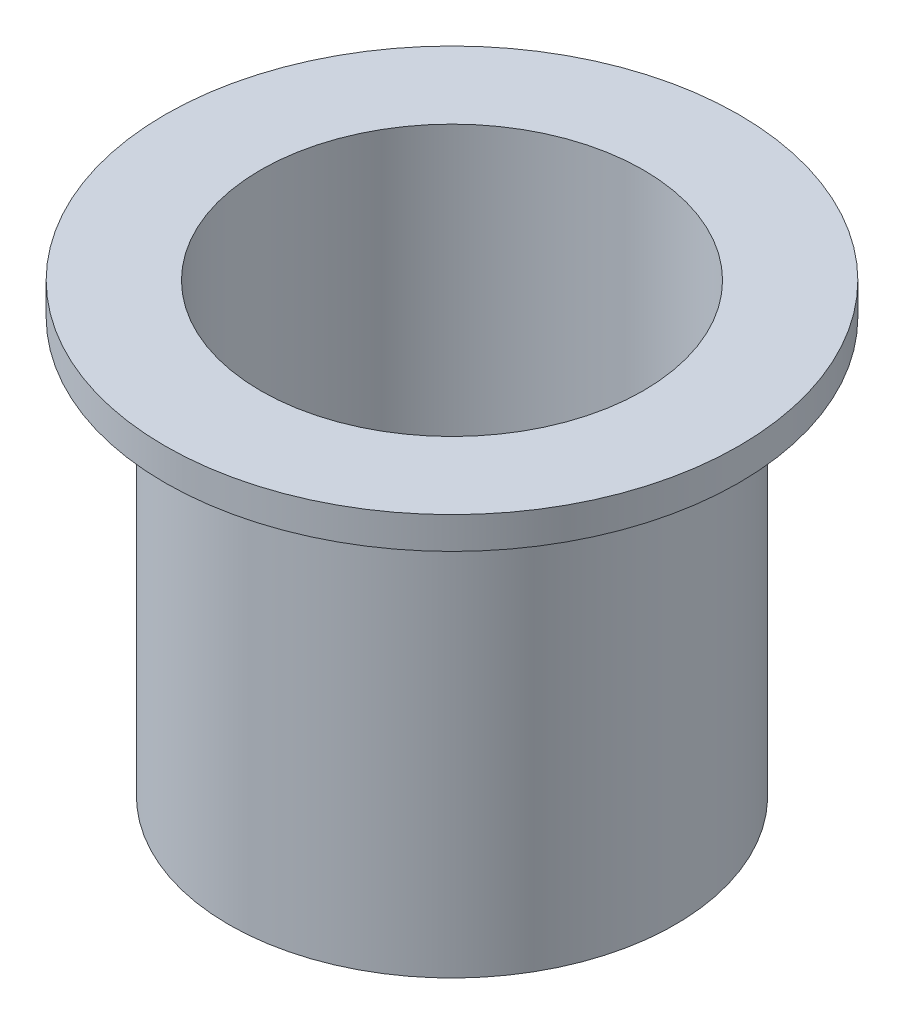
ISO-10303-21;
HEADER;
FILE_DESCRIPTION(('STEP AP214'),'2;1');
FILE_NAME('part.step','',(''),(''),'','','');
FILE_SCHEMA(('AUTOMOTIVE_DESIGN { 1 0 10303 214 1 1 1 1 }'));
ENDSEC;
DATA;
#1=APPLICATION_CONTEXT('core data for automotive mechanical design processes');
#2=APPLICATION_PROTOCOL_DEFINITION('international standard','automotive_design',2000,#1);
#3=PRODUCT_CONTEXT('',#1,'mechanical');
#4=PRODUCT('Part','Part','',(#3));
#5=PRODUCT_RELATED_PRODUCT_CATEGORY('part','',(#4));
#6=PRODUCT_DEFINITION_FORMATION('','',#4);
#7=PRODUCT_DEFINITION_CONTEXT('part definition',#1,'design');
#8=PRODUCT_DEFINITION('design','',#6,#7);
#9=PRODUCT_DEFINITION_SHAPE('','',#8);
#10=(LENGTH_UNIT() NAMED_UNIT(*) SI_UNIT(.MILLI.,.METRE.));
#11=(NAMED_UNIT(*) PLANE_ANGLE_UNIT() SI_UNIT($,.RADIAN.));
#12=(NAMED_UNIT(*) SI_UNIT($,.STERADIAN.) SOLID_ANGLE_UNIT());
#13=UNCERTAINTY_MEASURE_WITH_UNIT(LENGTH_MEASURE(1.E-05),#10,'distance_accuracy_value','');
#14=(GEOMETRIC_REPRESENTATION_CONTEXT(3) GLOBAL_UNCERTAINTY_ASSIGNED_CONTEXT((#13)) GLOBAL_UNIT_ASSIGNED_CONTEXT((#10,
#11,#12)) REPRESENTATION_CONTEXT('',''));
#15=CARTESIAN_POINT('',(0.,0.,0.));
#16=DIRECTION('',(0.,0.,1.));
#17=DIRECTION('',(1.,0.,0.));
#18=AXIS2_PLACEMENT_3D('',#15,#16,#17);
#19=CARTESIAN_POINT('',(0.,13.,0.));
#20=DIRECTION('',(0.,-1.,0.));
#21=DIRECTION('',(0.,0.,-1.));
#22=AXIS2_PLACEMENT_3D('',#19,#20,#21);
#23=CYLINDRICAL_SURFACE('',#22,7.);
#24=CARTESIAN_POINT('',(0.,13.,0.));
#25=DIRECTION('',(0.,1.,0.));
#26=DIRECTION('',(0.,0.,1.));
#27=AXIS2_PLACEMENT_3D('',#24,#25,#26);
#28=CIRCLE('',#27,7.);
#29=CARTESIAN_POINT('',(0.,13.,-7.));
#30=VERTEX_POINT('',#29);
#31=EDGE_CURVE('E10',#30,#30,#28,.T.);
#32=CARTESIAN_POINT('',(0.,0.,0.));
#33=DIRECTION('',(0.,1.,0.));
#34=DIRECTION('',(0.,0.,1.));
#35=AXIS2_PLACEMENT_3D('',#32,#33,#34);
#36=CIRCLE('',#35,7.);
#37=CARTESIAN_POINT('',(0.,0.,-7.));
#38=VERTEX_POINT('',#37);
#39=EDGE_CURVE('E40',#38,#38,#36,.T.);
#40=CARTESIAN_POINT('',(0.,13.,-7.));
#41=CARTESIAN_POINT('',(0.,12.8645833333333,-7.));
#42=CARTESIAN_POINT('',(0.,12.7291666666667,-7.));
#43=CARTESIAN_POINT('',(0.,12.4583333333333,-7.));
#44=CARTESIAN_POINT('',(0.,12.3229166666667,-7.));
#45=CARTESIAN_POINT('',(0.,12.0520833333333,-7.));
#46=CARTESIAN_POINT('',(0.,11.9166666666667,-7.));
#47=CARTESIAN_POINT('',(0.,11.6458333333333,-7.));
#48=CARTESIAN_POINT('',(0.,11.5104166666667,-7.));
#49=CARTESIAN_POINT('',(0.,11.2395833333333,-7.));
#50=CARTESIAN_POINT('',(0.,11.1041666666667,-7.));
#51=CARTESIAN_POINT('',(0.,10.8333333333333,-7.));
#52=CARTESIAN_POINT('',(0.,10.6979166666667,-7.));
#53=CARTESIAN_POINT('',(0.,10.4270833333333,-7.));
#54=CARTESIAN_POINT('',(0.,10.2916666666667,-7.));
#55=CARTESIAN_POINT('',(0.,10.0208333333333,-7.));
#56=CARTESIAN_POINT('',(0.,9.88541666666667,-7.));
#57=CARTESIAN_POINT('',(0.,9.61458333333333,-7.));
#58=CARTESIAN_POINT('',(0.,9.47916666666667,-7.));
#59=CARTESIAN_POINT('',(0.,9.20833333333333,-7.));
#60=CARTESIAN_POINT('',(0.,9.07291666666667,-7.));
#61=CARTESIAN_POINT('',(0.,8.80208333333333,-7.));
#62=CARTESIAN_POINT('',(0.,8.66666666666667,-7.));
#63=CARTESIAN_POINT('',(0.,8.39583333333333,-7.));
#64=CARTESIAN_POINT('',(0.,8.26041666666667,-7.));
#65=CARTESIAN_POINT('',(0.,7.98958333333333,-7.));
#66=CARTESIAN_POINT('',(0.,7.85416666666667,-7.));
#67=CARTESIAN_POINT('',(0.,7.58333333333333,-7.));
#68=CARTESIAN_POINT('',(0.,7.44791666666667,-7.));
#69=CARTESIAN_POINT('',(0.,7.17708333333333,-7.));
#70=CARTESIAN_POINT('',(0.,7.04166666666667,-7.));
#71=CARTESIAN_POINT('',(0.,6.77083333333333,-7.));
#72=CARTESIAN_POINT('',(0.,6.63541666666667,-7.));
#73=CARTESIAN_POINT('',(0.,6.36458333333333,-7.));
#74=CARTESIAN_POINT('',(0.,6.22916666666667,-7.));
#75=CARTESIAN_POINT('',(0.,5.95833333333333,-7.));
#76=CARTESIAN_POINT('',(0.,5.82291666666667,-7.));
#77=CARTESIAN_POINT('',(0.,5.55208333333333,-7.));
#78=CARTESIAN_POINT('',(0.,5.41666666666667,-7.));
#79=CARTESIAN_POINT('',(0.,5.14583333333333,-7.));
#80=CARTESIAN_POINT('',(0.,5.01041666666667,-7.));
#81=CARTESIAN_POINT('',(0.,4.73958333333333,-7.));
#82=CARTESIAN_POINT('',(0.,4.60416666666667,-7.));
#83=CARTESIAN_POINT('',(0.,4.33333333333333,-7.));
#84=CARTESIAN_POINT('',(0.,4.19791666666667,-7.));
#85=CARTESIAN_POINT('',(0.,3.92708333333333,-7.));
#86=CARTESIAN_POINT('',(0.,3.79166666666667,-7.));
#87=CARTESIAN_POINT('',(0.,3.52083333333333,-7.));
#88=CARTESIAN_POINT('',(0.,3.38541666666667,-7.));
#89=CARTESIAN_POINT('',(0.,3.11458333333333,-7.));
#90=CARTESIAN_POINT('',(0.,2.97916666666667,-7.));
#91=CARTESIAN_POINT('',(0.,2.70833333333333,-7.));
#92=CARTESIAN_POINT('',(0.,2.57291666666667,-7.));
#93=CARTESIAN_POINT('',(0.,2.30208333333333,-7.));
#94=CARTESIAN_POINT('',(0.,2.16666666666667,-7.));
#95=CARTESIAN_POINT('',(0.,1.89583333333333,-7.));
#96=CARTESIAN_POINT('',(0.,1.76041666666667,-7.));
#97=CARTESIAN_POINT('',(0.,1.48958333333333,-7.));
#98=CARTESIAN_POINT('',(0.,1.35416666666667,-7.));
#99=CARTESIAN_POINT('',(0.,1.08333333333333,-7.));
#100=CARTESIAN_POINT('',(0.,0.947916666666667,-7.));
#101=CARTESIAN_POINT('',(0.,0.677083333333334,-7.));
#102=CARTESIAN_POINT('',(0.,0.541666666666667,-7.));
#103=CARTESIAN_POINT('',(0.,0.270833333333334,-7.));
#104=CARTESIAN_POINT('',(0.,0.135416666666667,-7.));
#105=CARTESIAN_POINT('',(0.,0.,-7.));
#106=B_SPLINE_CURVE_WITH_KNOTS('',3,(#40,#41,#42,#43,#44,#45,#46,#47,#48,#49,#50,#51,#52,#53,
#54,#55,#56,#57,#58,#59,#60,#61,#62,#63,#64,#65,#66,#67,#68,#69,#70,#71,#72,#73,#74,#75,#76,#77,
#78,#79,#80,#81,#82,#83,#84,#85,#86,#87,#88,#89,#90,#91,#92,#93,#94,#95,#96,#97,#98,#99,#100,
#101,#102,#103,#104,#105),.UNSPECIFIED.,.F.,.F.,(4,2,2,2,2,2,2,2,2,2,2,2,2,2,2,2,2,2,2,2,2,2,2,
2,2,2,2,2,2,2,2,2,4),(0.,0.406249999999999,0.812499999999999,1.21875,1.625,2.03125,2.4375,
2.84375,3.25,3.65625,4.0625,4.46875,4.875,5.28125,5.6875,6.09375,6.5,6.90625,7.3125,7.71875,
8.125,8.53125,8.9375,9.34375,9.75,10.15625,10.5625,10.96875,11.375,11.78125,12.1875,12.59375,
13.),.UNSPECIFIED.);
#107=EDGE_CURVE('BSEAM33',#30,#38,#106,.T.);
#108=ORIENTED_EDGE('',*,*,#31,.F.);
#109=ORIENTED_EDGE('',*,*,#39,.T.);
#110=ORIENTED_EDGE('',*,*,#107,.T.);
#111=ORIENTED_EDGE('',*,*,#107,.F.);
#112=EDGE_LOOP('',(#108,#110,#109,#111));
#113=FACE_BOUND('',#112,.T.);
#114=ADVANCED_FACE('F33',(#113),#23,.T.);
#115=CARTESIAN_POINT('',(0.,0.,0.));
#116=DIRECTION('',(0.,1.,0.));
#117=DIRECTION('',(0.,0.,1.));
#118=AXIS2_PLACEMENT_3D('',#115,#116,#117);
#119=PLANE('',#118);
#120=CARTESIAN_POINT('',(0.,0.,0.));
#121=DIRECTION('',(0.,-1.,0.));
#122=DIRECTION('',(0.,0.,-1.));
#123=AXIS2_PLACEMENT_3D('',#120,#121,#122);
#124=CIRCLE('',#123,2.5);
#125=CARTESIAN_POINT('',(0.,0.,-2.5));
#126=VERTEX_POINT('',#125);
#127=EDGE_CURVE('E49',#126,#126,#124,.T.);
#128=ORIENTED_EDGE('',*,*,#127,.F.);
#129=EDGE_LOOP('',(#128));
#130=FACE_BOUND('',#129,.T.);
#131=ORIENTED_EDGE('',*,*,#39,.F.);
#132=EDGE_LOOP('',(#131));
#133=FACE_BOUND('',#132,.T.);
#134=ADVANCED_FACE('F88',(#130,#133),#119,.F.);
#135=CARTESIAN_POINT('',(0.,13.,0.));
#136=DIRECTION('',(0.,-1.,0.));
#137=DIRECTION('',(0.,0.,-1.));
#138=AXIS2_PLACEMENT_3D('',#135,#136,#137);
#139=CYLINDRICAL_SURFACE('',#138,6.);
#140=CARTESIAN_POINT('',(0.,14.,0.));
#141=DIRECTION('',(0.,1.,0.));
#142=DIRECTION('',(0.,0.,1.));
#143=AXIS2_PLACEMENT_3D('',#140,#141,#142);
#144=CIRCLE('',#143,6.);
#145=CARTESIAN_POINT('',(0.,14.,-6.));
#146=VERTEX_POINT('',#145);
#147=EDGE_CURVE('E56',#146,#146,#144,.T.);
#148=CARTESIAN_POINT('',(0.,0.999999999999999,0.));
#149=DIRECTION('',(0.,1.,0.));
#150=DIRECTION('',(0.,0.,1.));
#151=AXIS2_PLACEMENT_3D('',#148,#149,#150);
#152=CIRCLE('',#151,6.);
#153=CARTESIAN_POINT('',(0.,0.999999999999997,-6.));
#154=VERTEX_POINT('',#153);
#155=EDGE_CURVE('E45',#154,#154,#152,.T.);
#156=CARTESIAN_POINT('',(0.,14.,-6.));
#157=CARTESIAN_POINT('',(0.,13.8645833333333,-6.));
#158=CARTESIAN_POINT('',(0.,13.7291666666667,-6.));
#159=CARTESIAN_POINT('',(0.,13.4583333333333,-6.));
#160=CARTESIAN_POINT('',(0.,13.3229166666667,-6.));
#161=CARTESIAN_POINT('',(0.,13.0520833333333,-6.));
#162=CARTESIAN_POINT('',(0.,12.9166666666667,-6.));
#163=CARTESIAN_POINT('',(0.,12.6458333333333,-6.));
#164=CARTESIAN_POINT('',(0.,12.5104166666667,-6.));
#165=CARTESIAN_POINT('',(0.,12.2395833333333,-6.));
#166=CARTESIAN_POINT('',(0.,12.1041666666667,-6.));
#167=CARTESIAN_POINT('',(0.,11.8333333333333,-6.));
#168=CARTESIAN_POINT('',(0.,11.6979166666667,-6.));
#169=CARTESIAN_POINT('',(0.,11.4270833333333,-6.));
#170=CARTESIAN_POINT('',(0.,11.2916666666667,-6.));
#171=CARTESIAN_POINT('',(0.,11.0208333333333,-6.));
#172=CARTESIAN_POINT('',(0.,10.8854166666667,-6.));
#173=CARTESIAN_POINT('',(0.,10.6145833333333,-6.));
#174=CARTESIAN_POINT('',(0.,10.4791666666667,-6.));
#175=CARTESIAN_POINT('',(0.,10.2083333333333,-6.));
#176=CARTESIAN_POINT('',(0.,10.0729166666667,-6.));
#177=CARTESIAN_POINT('',(0.,9.80208333333333,-6.));
#178=CARTESIAN_POINT('',(0.,9.66666666666667,-6.));
#179=CARTESIAN_POINT('',(0.,9.39583333333333,-6.));
#180=CARTESIAN_POINT('',(0.,9.26041666666666,-6.));
#181=CARTESIAN_POINT('',(0.,8.98958333333333,-6.));
#182=CARTESIAN_POINT('',(0.,8.85416666666666,-6.));
#183=CARTESIAN_POINT('',(0.,8.58333333333333,-6.));
#184=CARTESIAN_POINT('',(0.,8.44791666666666,-6.));
#185=CARTESIAN_POINT('',(0.,8.17708333333333,-6.));
#186=CARTESIAN_POINT('',(0.,8.04166666666666,-6.));
#187=CARTESIAN_POINT('',(0.,7.77083333333333,-6.));
#188=CARTESIAN_POINT('',(0.,7.63541666666666,-6.));
#189=CARTESIAN_POINT('',(0.,7.36458333333333,-6.));
#190=CARTESIAN_POINT('',(0.,7.22916666666666,-6.));
#191=CARTESIAN_POINT('',(0.,6.95833333333333,-6.));
#192=CARTESIAN_POINT('',(0.,6.82291666666666,-6.));
#193=CARTESIAN_POINT('',(0.,6.55208333333333,-6.));
#194=CARTESIAN_POINT('',(0.,6.41666666666666,-6.));
#195=CARTESIAN_POINT('',(0.,6.14583333333333,-6.));
#196=CARTESIAN_POINT('',(0.,6.01041666666667,-6.));
#197=CARTESIAN_POINT('',(0.,5.73958333333333,-6.));
#198=CARTESIAN_POINT('',(0.,5.60416666666666,-6.));
#199=CARTESIAN_POINT('',(0.,5.33333333333333,-6.));
#200=CARTESIAN_POINT('',(0.,5.19791666666666,-6.));
#201=CARTESIAN_POINT('',(0.,4.92708333333333,-6.));
#202=CARTESIAN_POINT('',(0.,4.79166666666666,-6.));
#203=CARTESIAN_POINT('',(0.,4.52083333333333,-6.));
#204=CARTESIAN_POINT('',(0.,4.38541666666666,-6.));
#205=CARTESIAN_POINT('',(0.,4.11458333333333,-6.));
#206=CARTESIAN_POINT('',(0.,3.97916666666667,-6.));
#207=CARTESIAN_POINT('',(0.,3.70833333333333,-6.));
#208=CARTESIAN_POINT('',(0.,3.57291666666667,-6.));
#209=CARTESIAN_POINT('',(0.,3.30208333333333,-6.));
#210=CARTESIAN_POINT('',(0.,3.16666666666667,-6.));
#211=CARTESIAN_POINT('',(0.,2.89583333333333,-6.));
#212=CARTESIAN_POINT('',(0.,2.76041666666667,-6.));
#213=CARTESIAN_POINT('',(0.,2.48958333333333,-6.));
#214=CARTESIAN_POINT('',(0.,2.35416666666667,-6.));
#215=CARTESIAN_POINT('',(0.,2.08333333333333,-6.));
#216=CARTESIAN_POINT('',(0.,1.94791666666666,-6.));
#217=CARTESIAN_POINT('',(0.,1.67708333333333,-6.));
#218=CARTESIAN_POINT('',(0.,1.54166666666666,-6.));
#219=CARTESIAN_POINT('',(0.,1.27083333333333,-6.));
#220=CARTESIAN_POINT('',(0.,1.13541666666666,-6.));
#221=CARTESIAN_POINT('',(0.,0.999999999999997,-6.));
#222=B_SPLINE_CURVE_WITH_KNOTS('',3,(#156,#157,#158,#159,#160,#161,#162,#163,#164,#165,#166,
#167,#168,#169,#170,#171,#172,#173,#174,#175,#176,#177,#178,#179,#180,#181,#182,#183,#184,#185,
#186,#187,#188,#189,#190,#191,#192,#193,#194,#195,#196,#197,#198,#199,#200,#201,#202,#203,#204,
#205,#206,#207,#208,#209,#210,#211,#212,#213,#214,#215,#216,#217,#218,#219,#220,#221),
.UNSPECIFIED.,.F.,.F.,(4,2,2,2,2,2,2,2,2,2,2,2,2,2,2,2,2,2,2,2,2,2,2,2,2,2,2,2,2,2,2,2,4),(0.,
0.406249999999999,0.812499999999999,1.21875,1.625,2.03125,2.4375,2.84375,3.25,3.65625,4.0625,
4.46875,4.875,5.28125,5.6875,6.09375,6.5,6.90625,7.3125,7.71875,8.125,8.53125,8.9375,9.34375,
9.75,10.15625,10.5625,10.96875,11.375,11.78125,12.1875,12.59375,13.),.UNSPECIFIED.);
#223=EDGE_CURVE('BSEAM62',#146,#154,#222,.T.);
#224=ORIENTED_EDGE('',*,*,#147,.T.);
#225=ORIENTED_EDGE('',*,*,#155,.F.);
#226=ORIENTED_EDGE('',*,*,#223,.T.);
#227=ORIENTED_EDGE('',*,*,#223,.F.);
#228=EDGE_LOOP('',(#224,#226,#225,#227));
#229=FACE_BOUND('',#228,.T.);
#230=ADVANCED_FACE('F62',(#229),#139,.F.);
#231=CARTESIAN_POINT('',(0.,1.,0.));
#232=DIRECTION('',(0.,1.,0.));
#233=DIRECTION('',(0.,0.,1.));
#234=AXIS2_PLACEMENT_3D('',#231,#232,#233);
#235=PLANE('',#234);
#236=CARTESIAN_POINT('',(0.,0.999999999999999,0.));
#237=DIRECTION('',(0.,1.,0.));
#238=DIRECTION('',(0.,0.,1.));
#239=AXIS2_PLACEMENT_3D('',#236,#237,#238);
#240=CIRCLE('',#239,2.5);
#241=CARTESIAN_POINT('',(0.,0.999999999999999,2.5));
#242=VERTEX_POINT('',#241);
#243=EDGE_CURVE('E36',#242,#242,#240,.T.);
#244=ORIENTED_EDGE('',*,*,#243,.F.);
#245=EDGE_LOOP('',(#244));
#246=FACE_BOUND('',#245,.T.);
#247=ORIENTED_EDGE('',*,*,#155,.T.);
#248=EDGE_LOOP('',(#247));
#249=FACE_BOUND('',#248,.T.);
#250=ADVANCED_FACE('F84',(#246,#249),#235,.T.);
#251=CARTESIAN_POINT('',(0.,10.,0.));
#252=DIRECTION('',(0.,-1.,0.));
#253=DIRECTION('',(0.,0.,-1.));
#254=AXIS2_PLACEMENT_3D('',#251,#252,#253);
#255=CYLINDRICAL_SURFACE('',#254,2.5);
#256=ORIENTED_EDGE('',*,*,#243,.T.);
#257=EDGE_LOOP('',(#256));
#258=FACE_BOUND('',#257,.T.);
#259=ORIENTED_EDGE('',*,*,#127,.T.);
#260=EDGE_LOOP('',(#259));
#261=FACE_BOUND('',#260,.T.);
#262=ADVANCED_FACE('F79',(#258,#261),#255,.F.);
#263=CARTESIAN_POINT('',(0.,13.,0.));
#264=DIRECTION('',(0.,1.,0.));
#265=DIRECTION('',(0.,0.,1.));
#266=AXIS2_PLACEMENT_3D('',#263,#264,#265);
#267=PLANE('',#266);
#268=ORIENTED_EDGE('',*,*,#31,.T.);
#269=EDGE_LOOP('',(#268));
#270=FACE_BOUND('',#269,.T.);
#271=CARTESIAN_POINT('',(0.,13.,0.));
#272=DIRECTION('',(0.,1.,0.));
#273=DIRECTION('',(0.,0.,1.));
#274=AXIS2_PLACEMENT_3D('',#271,#272,#273);
#275=CIRCLE('',#274,9.);
#276=CARTESIAN_POINT('',(0.,13.,9.));
#277=VERTEX_POINT('',#276);
#278=EDGE_CURVE('E53',#277,#277,#275,.T.);
#279=ORIENTED_EDGE('',*,*,#278,.F.);
#280=EDGE_LOOP('',(#279));
#281=FACE_BOUND('',#280,.T.);
#282=ADVANCED_FACE('F69',(#270,#281),#267,.F.);
#283=CARTESIAN_POINT('',(0.,14.,0.));
#284=DIRECTION('',(0.,1.,0.));
#285=DIRECTION('',(0.,0.,1.));
#286=AXIS2_PLACEMENT_3D('',#283,#284,#285);
#287=PLANE('',#286);
#288=ORIENTED_EDGE('',*,*,#147,.F.);
#289=EDGE_LOOP('',(#288));
#290=FACE_BOUND('',#289,.T.);
#291=CARTESIAN_POINT('',(0.,14.,0.));
#292=DIRECTION('',(0.,1.,0.));
#293=DIRECTION('',(0.,0.,1.));
#294=AXIS2_PLACEMENT_3D('',#291,#292,#293);
#295=CIRCLE('',#294,9.);
#296=CARTESIAN_POINT('',(0.,14.,9.));
#297=VERTEX_POINT('',#296);
#298=EDGE_CURVE('E52',#297,#297,#295,.T.);
#299=ORIENTED_EDGE('',*,*,#298,.T.);
#300=EDGE_LOOP('',(#299));
#301=FACE_BOUND('',#300,.T.);
#302=ADVANCED_FACE('F65',(#290,#301),#287,.T.);
#303=CARTESIAN_POINT('',(0.,14.,0.));
#304=DIRECTION('',(0.,-1.,0.));
#305=DIRECTION('',(0.,0.,-1.));
#306=AXIS2_PLACEMENT_3D('',#303,#304,#305);
#307=CYLINDRICAL_SURFACE('',#306,9.);
#308=ORIENTED_EDGE('',*,*,#298,.F.);
#309=EDGE_LOOP('',(#308));
#310=FACE_BOUND('',#309,.T.);
#311=ORIENTED_EDGE('',*,*,#278,.T.);
#312=EDGE_LOOP('',(#311));
#313=FACE_BOUND('',#312,.T.);
#314=ADVANCED_FACE('F68',(#310,#313),#307,.T.);
#315=CLOSED_SHELL('',(#114,#134,#230,#250,#262,#282,#302,#314));
#316=MANIFOLD_SOLID_BREP('B2',#315);
#317=ADVANCED_BREP_SHAPE_REPRESENTATION('',(#18,#316),#14);
#318=SHAPE_DEFINITION_REPRESENTATION(#9,#317);
ENDSEC;
END-ISO-10303-21;
